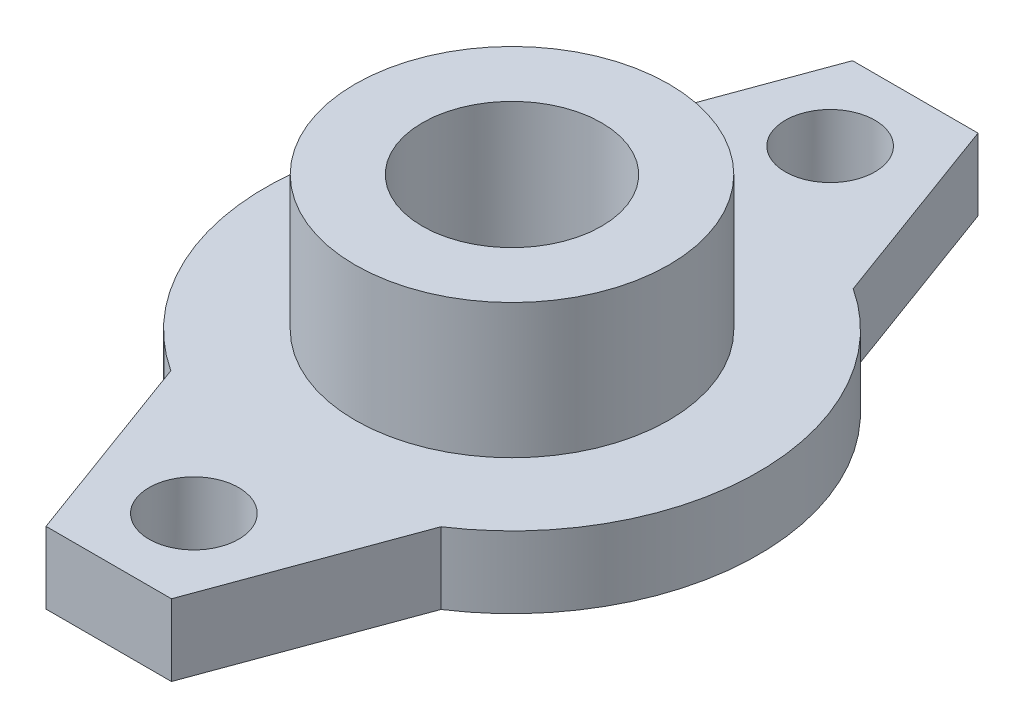
ISO-10303-21;
HEADER;
FILE_DESCRIPTION(('STEP AP214'),'2;1');
FILE_NAME('part.step','',(''),(''),'','','');
FILE_SCHEMA(('AUTOMOTIVE_DESIGN { 1 0 10303 214 1 1 1 1 }'));
ENDSEC;
DATA;
#1=APPLICATION_CONTEXT('core data for automotive mechanical design processes');
#2=APPLICATION_PROTOCOL_DEFINITION('international standard','automotive_design',2000,#1);
#3=PRODUCT_CONTEXT('',#1,'mechanical');
#4=PRODUCT('Part','Part','',(#3));
#5=PRODUCT_RELATED_PRODUCT_CATEGORY('part','',(#4));
#6=PRODUCT_DEFINITION_FORMATION('','',#4);
#7=PRODUCT_DEFINITION_CONTEXT('part definition',#1,'design');
#8=PRODUCT_DEFINITION('design','',#6,#7);
#9=PRODUCT_DEFINITION_SHAPE('','',#8);
#10=(LENGTH_UNIT() NAMED_UNIT(*) SI_UNIT(.MILLI.,.METRE.));
#11=(NAMED_UNIT(*) PLANE_ANGLE_UNIT() SI_UNIT($,.RADIAN.));
#12=(NAMED_UNIT(*) SI_UNIT($,.STERADIAN.) SOLID_ANGLE_UNIT());
#13=UNCERTAINTY_MEASURE_WITH_UNIT(LENGTH_MEASURE(1.E-05),#10,'distance_accuracy_value','');
#14=(GEOMETRIC_REPRESENTATION_CONTEXT(3) GLOBAL_UNCERTAINTY_ASSIGNED_CONTEXT((#13)) GLOBAL_UNIT_ASSIGNED_CONTEXT((#10,
#11,#12)) REPRESENTATION_CONTEXT('',''));
#15=CARTESIAN_POINT('',(0.,0.,0.));
#16=DIRECTION('',(0.,0.,1.));
#17=DIRECTION('',(1.,0.,0.));
#18=AXIS2_PLACEMENT_3D('',#15,#16,#17);
#19=CARTESIAN_POINT('',(0.,8.,0.));
#20=DIRECTION('',(0.,-1.,0.));
#21=DIRECTION('',(0.,0.,-1.));
#22=AXIS2_PLACEMENT_3D('',#19,#20,#21);
#23=CYLINDRICAL_SURFACE('',#22,27.5);
#24=CARTESIAN_POINT('',(0.,0.,0.));
#25=DIRECTION('',(0.,1.,0.));
#26=DIRECTION('',(0.,0.,-1.));
#27=AXIS2_PLACEMENT_3D('',#24,#25,#26);
#28=CIRCLE('',#27,27.5);
#29=CARTESIAN_POINT('',(-15.0748134316813,0.,-23.));
#30=VERTEX_POINT('',#29);
#31=CARTESIAN_POINT('',(-15.0748134316813,0.,23.));
#32=VERTEX_POINT('',#31);
#33=EDGE_CURVE('E135',#30,#32,#28,.T.);
#34=ORIENTED_EDGE('',*,*,#33,.T.);
#35=DIRECTION('',(0.,-1.,0.));
#36=VECTOR('',#35,1.);
#37=CARTESIAN_POINT('',(-15.0748134316813,8.,23.));
#38=LINE('',#37,#36);
#39=CARTESIAN_POINT('',(-15.0748134316813,8.,23.));
#40=VERTEX_POINT('',#39);
#41=EDGE_CURVE('E45',#40,#32,#38,.T.);
#42=ORIENTED_EDGE('',*,*,#41,.F.);
#43=CARTESIAN_POINT('',(0.,8.,0.));
#44=DIRECTION('',(0.,1.,0.));
#45=DIRECTION('',(0.,0.,-1.));
#46=AXIS2_PLACEMENT_3D('',#43,#44,#45);
#47=CIRCLE('',#46,27.5);
#48=CARTESIAN_POINT('',(-15.0748134316813,8.,-23.));
#49=VERTEX_POINT('',#48);
#50=EDGE_CURVE('E150',#49,#40,#47,.T.);
#51=ORIENTED_EDGE('',*,*,#50,.F.);
#52=DIRECTION('',(0.,-1.,0.));
#53=VECTOR('',#52,1.);
#54=CARTESIAN_POINT('',(-15.0748134316813,8.,-23.));
#55=LINE('',#54,#53);
#56=EDGE_CURVE('E131',#49,#30,#55,.T.);
#57=ORIENTED_EDGE('',*,*,#56,.T.);
#58=EDGE_LOOP('',(#34,#42,#51,#57));
#59=FACE_BOUND('',#58,.T.);
#60=ADVANCED_FACE('F36',(#59),#23,.T.);
#61=CARTESIAN_POINT('',(-15.0748134316813,8.,23.));
#62=DIRECTION('',(0.938763907079823,0.,-0.344561063912082));
#63=DIRECTION('',(-0.344561063912082,0.,-0.938763907079823));
#64=AXIS2_PLACEMENT_3D('',#61,#62,#63);
#65=PLANE('',#64);
#66=DIRECTION('',(0.344561063912082,0.,0.938763907079823));
#67=VECTOR('',#66,1.);
#68=CARTESIAN_POINT('',(-15.0748134316813,0.,23.));
#69=LINE('',#68,#67);
#70=CARTESIAN_POINT('',(-7.,0.,45.));
#71=VERTEX_POINT('',#70);
#72=EDGE_CURVE('E138',#32,#71,#69,.T.);
#73=ORIENTED_EDGE('',*,*,#72,.T.);
#74=DIRECTION('',(0.,-1.,0.));
#75=VECTOR('',#74,1.);
#76=CARTESIAN_POINT('',(-7.,8.,45.));
#77=LINE('',#76,#75);
#78=CARTESIAN_POINT('',(-7.,8.,45.));
#79=VERTEX_POINT('',#78);
#80=EDGE_CURVE('E160',#79,#71,#77,.T.);
#81=ORIENTED_EDGE('',*,*,#80,.F.);
#82=DIRECTION('',(0.344561063912082,0.,0.938763907079823));
#83=VECTOR('',#82,1.);
#84=CARTESIAN_POINT('',(-15.0748134316813,8.,23.));
#85=LINE('',#84,#83);
#86=EDGE_CURVE('E98',#40,#79,#85,.T.);
#87=ORIENTED_EDGE('',*,*,#86,.F.);
#88=ORIENTED_EDGE('',*,*,#41,.T.);
#89=EDGE_LOOP('',(#73,#81,#87,#88));
#90=FACE_BOUND('',#89,.T.);
#91=ADVANCED_FACE('F219',(#90),#65,.F.);
#92=CARTESIAN_POINT('',(-7.,8.,45.));
#93=DIRECTION('',(0.,0.,-1.));
#94=DIRECTION('',(-1.,0.,0.));
#95=AXIS2_PLACEMENT_3D('',#92,#93,#94);
#96=PLANE('',#95);
#97=DIRECTION('',(1.,0.,0.));
#98=VECTOR('',#97,1.);
#99=CARTESIAN_POINT('',(-7.,0.,45.));
#100=LINE('',#99,#98);
#101=CARTESIAN_POINT('',(7.,0.,45.));
#102=VERTEX_POINT('',#101);
#103=EDGE_CURVE('E141',#71,#102,#100,.T.);
#104=ORIENTED_EDGE('',*,*,#103,.T.);
#105=DIRECTION('',(0.,-1.,0.));
#106=VECTOR('',#105,1.);
#107=CARTESIAN_POINT('',(7.,8.,45.));
#108=LINE('',#107,#106);
#109=CARTESIAN_POINT('',(7.,8.,45.));
#110=VERTEX_POINT('',#109);
#111=EDGE_CURVE('E157',#110,#102,#108,.T.);
#112=ORIENTED_EDGE('',*,*,#111,.F.);
#113=DIRECTION('',(1.,0.,0.));
#114=VECTOR('',#113,1.);
#115=CARTESIAN_POINT('',(-7.,8.,45.));
#116=LINE('',#115,#114);
#117=EDGE_CURVE('E187',#79,#110,#116,.T.);
#118=ORIENTED_EDGE('',*,*,#117,.F.);
#119=ORIENTED_EDGE('',*,*,#80,.T.);
#120=EDGE_LOOP('',(#104,#112,#118,#119));
#121=FACE_BOUND('',#120,.T.);
#122=ADVANCED_FACE('F223',(#121),#96,.F.);
#123=CARTESIAN_POINT('',(15.0748134316813,8.,23.));
#124=DIRECTION('',(-0.938763907079823,0.,-0.344561063912082));
#125=DIRECTION('',(-0.344561063912082,0.,0.938763907079823));
#126=AXIS2_PLACEMENT_3D('',#123,#124,#125);
#127=PLANE('',#126);
#128=DIRECTION('',(0.344561063912082,0.,-0.938763907079823));
#129=VECTOR('',#128,1.);
#130=CARTESIAN_POINT('',(15.0748134316813,0.,23.));
#131=LINE('',#130,#129);
#132=CARTESIAN_POINT('',(15.0748134316813,0.,23.));
#133=VERTEX_POINT('',#132);
#134=EDGE_CURVE('E143',#102,#133,#131,.T.);
#135=ORIENTED_EDGE('',*,*,#134,.T.);
#136=DIRECTION('',(0.,-1.,0.));
#137=VECTOR('',#136,1.);
#138=CARTESIAN_POINT('',(15.0748134316813,8.,23.));
#139=LINE('',#138,#137);
#140=CARTESIAN_POINT('',(15.0748134316813,8.,23.));
#141=VERTEX_POINT('',#140);
#142=EDGE_CURVE('E154',#141,#133,#139,.T.);
#143=ORIENTED_EDGE('',*,*,#142,.F.);
#144=DIRECTION('',(0.344561063912082,0.,-0.938763907079823));
#145=VECTOR('',#144,1.);
#146=CARTESIAN_POINT('',(15.0748134316813,8.,23.));
#147=LINE('',#146,#145);
#148=EDGE_CURVE('E189',#110,#141,#147,.T.);
#149=ORIENTED_EDGE('',*,*,#148,.F.);
#150=ORIENTED_EDGE('',*,*,#111,.T.);
#151=EDGE_LOOP('',(#135,#143,#149,#150));
#152=FACE_BOUND('',#151,.T.);
#153=ADVANCED_FACE('F195',(#152),#127,.F.);
#154=CARTESIAN_POINT('',(0.,8.,0.));
#155=DIRECTION('',(0.,-1.,0.));
#156=DIRECTION('',(0.,0.,-1.));
#157=AXIS2_PLACEMENT_3D('',#154,#155,#156);
#158=CYLINDRICAL_SURFACE('',#157,27.5);
#159=CARTESIAN_POINT('',(0.,0.,0.));
#160=DIRECTION('',(0.,1.,0.));
#161=DIRECTION('',(0.,0.,1.));
#162=AXIS2_PLACEMENT_3D('',#159,#160,#161);
#163=CIRCLE('',#162,27.5);
#164=CARTESIAN_POINT('',(15.0748134316813,0.,-23.));
#165=VERTEX_POINT('',#164);
#166=EDGE_CURVE('E145',#133,#165,#163,.T.);
#167=ORIENTED_EDGE('',*,*,#166,.T.);
#168=DIRECTION('',(0.,-1.,0.));
#169=VECTOR('',#168,1.);
#170=CARTESIAN_POINT('',(15.0748134316813,8.,-23.));
#171=LINE('',#170,#169);
#172=CARTESIAN_POINT('',(15.0748134316813,8.,-23.));
#173=VERTEX_POINT('',#172);
#174=EDGE_CURVE('E126',#173,#165,#171,.T.);
#175=ORIENTED_EDGE('',*,*,#174,.F.);
#176=CARTESIAN_POINT('',(0.,8.,0.));
#177=DIRECTION('',(0.,1.,0.));
#178=DIRECTION('',(0.,0.,1.));
#179=AXIS2_PLACEMENT_3D('',#176,#177,#178);
#180=CIRCLE('',#179,27.5);
#181=EDGE_CURVE('E117',#141,#173,#180,.T.);
#182=ORIENTED_EDGE('',*,*,#181,.F.);
#183=ORIENTED_EDGE('',*,*,#142,.T.);
#184=EDGE_LOOP('',(#167,#175,#182,#183));
#185=FACE_BOUND('',#184,.T.);
#186=ADVANCED_FACE('F199',(#185),#158,.T.);
#187=CARTESIAN_POINT('',(15.0748134316813,8.,-23.));
#188=DIRECTION('',(-0.938763907079823,0.,0.344561063912082));
#189=DIRECTION('',(0.344561063912082,0.,0.938763907079823));
#190=AXIS2_PLACEMENT_3D('',#187,#188,#189);
#191=PLANE('',#190);
#192=DIRECTION('',(-0.344561063912082,0.,-0.938763907079823));
#193=VECTOR('',#192,1.);
#194=CARTESIAN_POINT('',(15.0748134316813,0.,-23.));
#195=LINE('',#194,#193);
#196=CARTESIAN_POINT('',(7.,0.,-45.));
#197=VERTEX_POINT('',#196);
#198=EDGE_CURVE('E125',#165,#197,#195,.T.);
#199=ORIENTED_EDGE('',*,*,#198,.T.);
#200=DIRECTION('',(0.,-1.,0.));
#201=VECTOR('',#200,1.);
#202=CARTESIAN_POINT('',(7.,8.,-45.));
#203=LINE('',#202,#201);
#204=CARTESIAN_POINT('',(7.,8.,-45.));
#205=VERTEX_POINT('',#204);
#206=EDGE_CURVE('E122',#205,#197,#203,.T.);
#207=ORIENTED_EDGE('',*,*,#206,.F.);
#208=DIRECTION('',(-0.344561063912082,0.,-0.938763907079823));
#209=VECTOR('',#208,1.);
#210=CARTESIAN_POINT('',(15.0748134316813,8.,-23.));
#211=LINE('',#210,#209);
#212=EDGE_CURVE('E111',#173,#205,#211,.T.);
#213=ORIENTED_EDGE('',*,*,#212,.F.);
#214=ORIENTED_EDGE('',*,*,#174,.T.);
#215=EDGE_LOOP('',(#199,#207,#213,#214));
#216=FACE_BOUND('',#215,.T.);
#217=ADVANCED_FACE('F123',(#216),#191,.F.);
#218=CARTESIAN_POINT('',(-7.,8.,-45.));
#219=DIRECTION('',(0.,0.,1.));
#220=DIRECTION('',(1.,0.,0.));
#221=AXIS2_PLACEMENT_3D('',#218,#219,#220);
#222=PLANE('',#221);
#223=DIRECTION('',(-1.,0.,0.));
#224=VECTOR('',#223,1.);
#225=CARTESIAN_POINT('',(-7.,0.,-45.));
#226=LINE('',#225,#224);
#227=CARTESIAN_POINT('',(-7.,0.,-45.));
#228=VERTEX_POINT('',#227);
#229=EDGE_CURVE('E83',#197,#228,#226,.T.);
#230=ORIENTED_EDGE('',*,*,#229,.T.);
#231=DIRECTION('',(0.,-1.,0.));
#232=VECTOR('',#231,1.);
#233=CARTESIAN_POINT('',(-7.,8.,-45.));
#234=LINE('',#233,#232);
#235=CARTESIAN_POINT('',(-7.,8.,-45.));
#236=VERTEX_POINT('',#235);
#237=EDGE_CURVE('E127',#236,#228,#234,.T.);
#238=ORIENTED_EDGE('',*,*,#237,.F.);
#239=DIRECTION('',(-1.,0.,0.));
#240=VECTOR('',#239,1.);
#241=CARTESIAN_POINT('',(-7.,8.,-45.));
#242=LINE('',#241,#240);
#243=EDGE_CURVE('E115',#205,#236,#242,.T.);
#244=ORIENTED_EDGE('',*,*,#243,.F.);
#245=ORIENTED_EDGE('',*,*,#206,.T.);
#246=EDGE_LOOP('',(#230,#238,#244,#245));
#247=FACE_BOUND('',#246,.T.);
#248=ADVANCED_FACE('F129',(#247),#222,.F.);
#249=CARTESIAN_POINT('',(-15.0748134316813,8.,-23.));
#250=DIRECTION('',(0.938763907079823,0.,0.344561063912082));
#251=DIRECTION('',(0.344561063912082,0.,-0.938763907079823));
#252=AXIS2_PLACEMENT_3D('',#249,#250,#251);
#253=PLANE('',#252);
#254=DIRECTION('',(-0.344561063912082,0.,0.938763907079823));
#255=VECTOR('',#254,1.);
#256=CARTESIAN_POINT('',(-15.0748134316813,0.,-23.));
#257=LINE('',#256,#255);
#258=EDGE_CURVE('E89',#228,#30,#257,.T.);
#259=ORIENTED_EDGE('',*,*,#258,.T.);
#260=ORIENTED_EDGE('',*,*,#56,.F.);
#261=DIRECTION('',(-0.344561063912082,0.,0.938763907079823));
#262=VECTOR('',#261,1.);
#263=CARTESIAN_POINT('',(-15.0748134316813,8.,-23.));
#264=LINE('',#263,#262);
#265=EDGE_CURVE('E54',#236,#49,#264,.T.);
#266=ORIENTED_EDGE('',*,*,#265,.F.);
#267=ORIENTED_EDGE('',*,*,#237,.T.);
#268=EDGE_LOOP('',(#259,#260,#266,#267));
#269=FACE_BOUND('',#268,.T.);
#270=ADVANCED_FACE('F207',(#269),#253,.F.);
#271=CARTESIAN_POINT('',(0.,8.,0.));
#272=DIRECTION('',(0.,-1.,0.));
#273=DIRECTION('',(0.,0.,-1.));
#274=AXIS2_PLACEMENT_3D('',#271,#272,#273);
#275=PLANE('',#274);
#276=CARTESIAN_POINT('',(0.,8.,-35.5));
#277=DIRECTION('',(0.,1.,0.));
#278=DIRECTION('',(0.,0.,1.));
#279=AXIS2_PLACEMENT_3D('',#276,#277,#278);
#280=CIRCLE('',#279,5.);
#281=CARTESIAN_POINT('',(0.,8.,-30.5));
#282=VERTEX_POINT('',#281);
#283=EDGE_CURVE('E169',#282,#282,#280,.T.);
#284=ORIENTED_EDGE('',*,*,#283,.F.);
#285=EDGE_LOOP('',(#284));
#286=FACE_BOUND('',#285,.T.);
#287=CARTESIAN_POINT('',(0.,8.,35.5));
#288=DIRECTION('',(0.,1.,0.));
#289=DIRECTION('',(0.,0.,1.));
#290=AXIS2_PLACEMENT_3D('',#287,#288,#289);
#291=CIRCLE('',#290,5.);
#292=CARTESIAN_POINT('',(0.,8.,40.5));
#293=VERTEX_POINT('',#292);
#294=EDGE_CURVE('E174',#293,#293,#291,.T.);
#295=ORIENTED_EDGE('',*,*,#294,.F.);
#296=EDGE_LOOP('',(#295));
#297=FACE_BOUND('',#296,.T.);
#298=CARTESIAN_POINT('',(0.,8.,0.));
#299=DIRECTION('',(0.,-1.,0.));
#300=DIRECTION('',(0.,0.,-1.));
#301=AXIS2_PLACEMENT_3D('',#298,#299,#300);
#302=CIRCLE('',#301,17.5);
#303=CARTESIAN_POINT('',(0.,8.,-17.5));
#304=VERTEX_POINT('',#303);
#305=EDGE_CURVE('E11',#304,#304,#302,.F.);
#306=ORIENTED_EDGE('',*,*,#305,.F.);
#307=EDGE_LOOP('',(#306));
#308=FACE_BOUND('',#307,.T.);
#309=ORIENTED_EDGE('',*,*,#50,.T.);
#310=ORIENTED_EDGE('',*,*,#86,.T.);
#311=ORIENTED_EDGE('',*,*,#117,.T.);
#312=ORIENTED_EDGE('',*,*,#148,.T.);
#313=ORIENTED_EDGE('',*,*,#181,.T.);
#314=ORIENTED_EDGE('',*,*,#212,.T.);
#315=ORIENTED_EDGE('',*,*,#243,.T.);
#316=ORIENTED_EDGE('',*,*,#265,.T.);
#317=EDGE_LOOP('',(#309,#310,#311,#312,#313,#314,#315,#316));
#318=FACE_BOUND('',#317,.T.);
#319=ADVANCED_FACE('F113',(#286,#297,#308,#318),#275,.F.);
#320=CARTESIAN_POINT('',(0.,0.,0.));
#321=DIRECTION('',(0.,-1.,0.));
#322=DIRECTION('',(0.,0.,-1.));
#323=AXIS2_PLACEMENT_3D('',#320,#321,#322);
#324=PLANE('',#323);
#325=CARTESIAN_POINT('',(0.,0.,-35.5));
#326=DIRECTION('',(0.,-1.,0.));
#327=DIRECTION('',(0.,0.,-1.));
#328=AXIS2_PLACEMENT_3D('',#325,#326,#327);
#329=CIRCLE('',#328,5.);
#330=CARTESIAN_POINT('',(0.,0.,-40.5));
#331=VERTEX_POINT('',#330);
#332=EDGE_CURVE('E39',#331,#331,#329,.T.);
#333=ORIENTED_EDGE('',*,*,#332,.F.);
#334=EDGE_LOOP('',(#333));
#335=FACE_BOUND('',#334,.T.);
#336=CARTESIAN_POINT('',(0.,0.,35.5));
#337=DIRECTION('',(0.,-1.,0.));
#338=DIRECTION('',(0.,0.,-1.));
#339=AXIS2_PLACEMENT_3D('',#336,#337,#338);
#340=CIRCLE('',#339,5.);
#341=CARTESIAN_POINT('',(0.,0.,30.5));
#342=VERTEX_POINT('',#341);
#343=EDGE_CURVE('E167',#342,#342,#340,.T.);
#344=ORIENTED_EDGE('',*,*,#343,.F.);
#345=EDGE_LOOP('',(#344));
#346=FACE_BOUND('',#345,.T.);
#347=CARTESIAN_POINT('',(0.,0.,0.));
#348=DIRECTION('',(0.,-1.,0.));
#349=DIRECTION('',(0.,0.,-1.));
#350=AXIS2_PLACEMENT_3D('',#347,#348,#349);
#351=CIRCLE('',#350,10.);
#352=CARTESIAN_POINT('',(0.,0.,-10.));
#353=VERTEX_POINT('',#352);
#354=EDGE_CURVE('E164',#353,#353,#351,.T.);
#355=ORIENTED_EDGE('',*,*,#354,.F.);
#356=EDGE_LOOP('',(#355));
#357=FACE_BOUND('',#356,.T.);
#358=ORIENTED_EDGE('',*,*,#33,.F.);
#359=ORIENTED_EDGE('',*,*,#258,.F.);
#360=ORIENTED_EDGE('',*,*,#229,.F.);
#361=ORIENTED_EDGE('',*,*,#198,.F.);
#362=ORIENTED_EDGE('',*,*,#166,.F.);
#363=ORIENTED_EDGE('',*,*,#134,.F.);
#364=ORIENTED_EDGE('',*,*,#103,.F.);
#365=ORIENTED_EDGE('',*,*,#72,.F.);
#366=EDGE_LOOP('',(#358,#359,#360,#361,#362,#363,#364,#365));
#367=FACE_BOUND('',#366,.T.);
#368=ADVANCED_FACE('F202',(#335,#346,#357,#367),#324,.T.);
#369=CARTESIAN_POINT('',(0.,23.,0.));
#370=DIRECTION('',(0.,1.,0.));
#371=DIRECTION('',(0.,0.,1.));
#372=AXIS2_PLACEMENT_3D('',#369,#370,#371);
#373=PLANE('',#372);
#374=CARTESIAN_POINT('',(0.,23.,0.));
#375=DIRECTION('',(0.,1.,0.));
#376=DIRECTION('',(0.,0.,1.));
#377=AXIS2_PLACEMENT_3D('',#374,#375,#376);
#378=CIRCLE('',#377,17.5);
#379=CARTESIAN_POINT('',(0.,23.,17.5));
#380=VERTEX_POINT('',#379);
#381=EDGE_CURVE('E139',#380,#380,#378,.T.);
#382=ORIENTED_EDGE('',*,*,#381,.T.);
#383=EDGE_LOOP('',(#382));
#384=FACE_BOUND('',#383,.T.);
#385=CARTESIAN_POINT('',(0.,23.,0.));
#386=DIRECTION('',(0.,1.,0.));
#387=DIRECTION('',(0.,0.,1.));
#388=AXIS2_PLACEMENT_3D('',#385,#386,#387);
#389=CIRCLE('',#388,10.);
#390=CARTESIAN_POINT('',(0.,23.,10.));
#391=VERTEX_POINT('',#390);
#392=EDGE_CURVE('E166',#391,#391,#389,.T.);
#393=ORIENTED_EDGE('',*,*,#392,.F.);
#394=EDGE_LOOP('',(#393));
#395=FACE_BOUND('',#394,.T.);
#396=ADVANCED_FACE('F255',(#384,#395),#373,.T.);
#397=CARTESIAN_POINT('',(0.,23.,0.));
#398=DIRECTION('',(0.,-1.,0.));
#399=DIRECTION('',(0.,0.,-1.));
#400=AXIS2_PLACEMENT_3D('',#397,#398,#399);
#401=CYLINDRICAL_SURFACE('',#400,17.5);
#402=ORIENTED_EDGE('',*,*,#381,.F.);
#403=EDGE_LOOP('',(#402));
#404=FACE_BOUND('',#403,.T.);
#405=ORIENTED_EDGE('',*,*,#305,.T.);
#406=EDGE_LOOP('',(#405));
#407=FACE_BOUND('',#406,.T.);
#408=ADVANCED_FACE('F260',(#404,#407),#401,.T.);
#409=CARTESIAN_POINT('',(0.,23.,0.));
#410=DIRECTION('',(0.,-1.,0.));
#411=DIRECTION('',(0.,0.,-1.));
#412=AXIS2_PLACEMENT_3D('',#409,#410,#411);
#413=CYLINDRICAL_SURFACE('',#412,10.);
#414=ORIENTED_EDGE('',*,*,#392,.T.);
#415=EDGE_LOOP('',(#414));
#416=FACE_BOUND('',#415,.T.);
#417=ORIENTED_EDGE('',*,*,#354,.T.);
#418=EDGE_LOOP('',(#417));
#419=FACE_BOUND('',#418,.T.);
#420=ADVANCED_FACE('F273',(#416,#419),#413,.F.);
#421=CARTESIAN_POINT('',(0.,-2.,35.5));
#422=DIRECTION('',(0.,1.,0.));
#423=DIRECTION('',(0.,0.,1.));
#424=AXIS2_PLACEMENT_3D('',#421,#422,#423);
#425=CYLINDRICAL_SURFACE('',#424,5.);
#426=ORIENTED_EDGE('',*,*,#343,.T.);
#427=EDGE_LOOP('',(#426));
#428=FACE_BOUND('',#427,.T.);
#429=ORIENTED_EDGE('',*,*,#294,.T.);
#430=EDGE_LOOP('',(#429));
#431=FACE_BOUND('',#430,.T.);
#432=ADVANCED_FACE('F285',(#428,#431),#425,.F.);
#433=CARTESIAN_POINT('',(0.,-2.,-35.5));
#434=DIRECTION('',(0.,1.,0.));
#435=DIRECTION('',(0.,0.,1.));
#436=AXIS2_PLACEMENT_3D('',#433,#434,#435);
#437=CYLINDRICAL_SURFACE('',#436,5.);
#438=ORIENTED_EDGE('',*,*,#332,.T.);
#439=EDGE_LOOP('',(#438));
#440=FACE_BOUND('',#439,.T.);
#441=ORIENTED_EDGE('',*,*,#283,.T.);
#442=EDGE_LOOP('',(#441));
#443=FACE_BOUND('',#442,.T.);
#444=ADVANCED_FACE('F308',(#440,#443),#437,.F.);
#445=CLOSED_SHELL('',(#60,#91,#122,#153,#186,#217,#248,#270,#319,#368,#396,#408,#420,#432,#444));
#446=MANIFOLD_SOLID_BREP('B2',#445);
#447=ADVANCED_BREP_SHAPE_REPRESENTATION('',(#18,#446),#14);
#448=SHAPE_DEFINITION_REPRESENTATION(#9,#447);
ENDSEC;
END-ISO-10303-21;
